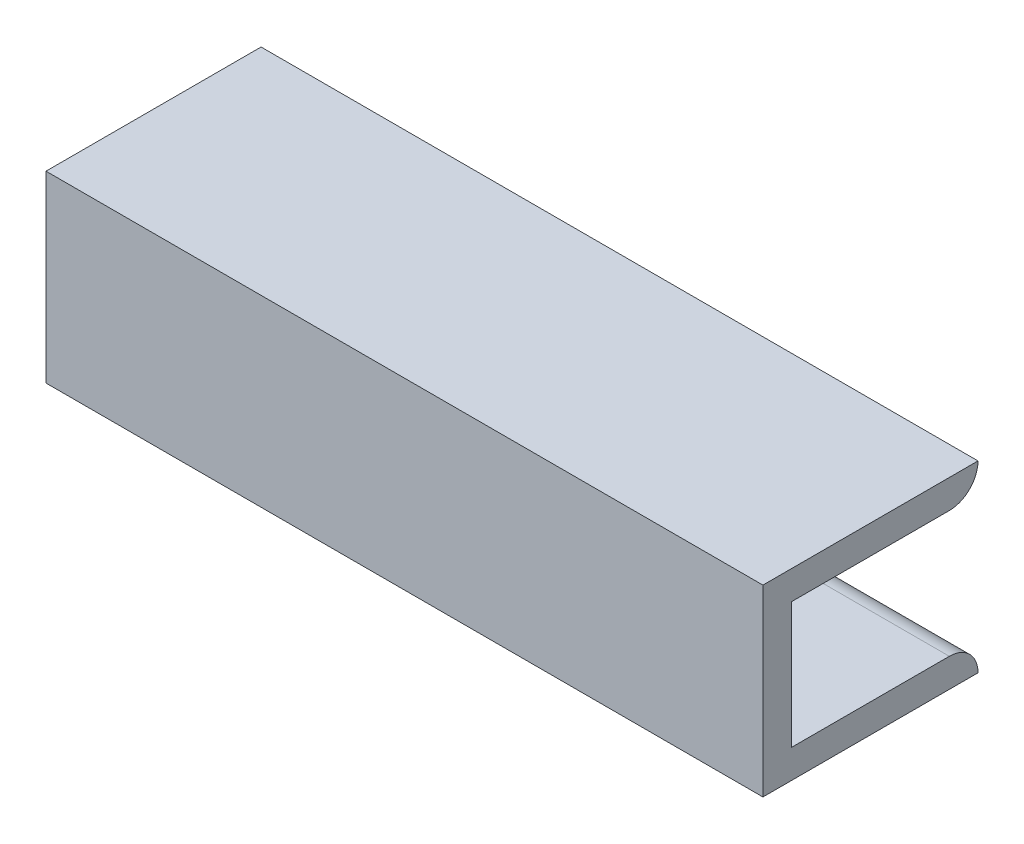
ISO-10303-21;
HEADER;
FILE_DESCRIPTION(('STEP AP214'),'2;1');
FILE_NAME('part.step','',(''),(''),'','','');
FILE_SCHEMA(('AUTOMOTIVE_DESIGN { 1 0 10303 214 1 1 1 1 }'));
ENDSEC;
DATA;
#1=APPLICATION_CONTEXT('core data for automotive mechanical design processes');
#2=APPLICATION_PROTOCOL_DEFINITION('international standard','automotive_design',2000,#1);
#3=PRODUCT_CONTEXT('',#1,'mechanical');
#4=PRODUCT('Part','Part','',(#3));
#5=PRODUCT_RELATED_PRODUCT_CATEGORY('part','',(#4));
#6=PRODUCT_DEFINITION_FORMATION('','',#4);
#7=PRODUCT_DEFINITION_CONTEXT('part definition',#1,'design');
#8=PRODUCT_DEFINITION('design','',#6,#7);
#9=PRODUCT_DEFINITION_SHAPE('','',#8);
#10=(LENGTH_UNIT() NAMED_UNIT(*) SI_UNIT(.MILLI.,.METRE.));
#11=(NAMED_UNIT(*) PLANE_ANGLE_UNIT() SI_UNIT($,.RADIAN.));
#12=(NAMED_UNIT(*) SI_UNIT($,.STERADIAN.) SOLID_ANGLE_UNIT());
#13=UNCERTAINTY_MEASURE_WITH_UNIT(LENGTH_MEASURE(1.E-05),#10,'distance_accuracy_value','');
#14=(GEOMETRIC_REPRESENTATION_CONTEXT(3) GLOBAL_UNCERTAINTY_ASSIGNED_CONTEXT((#13)) GLOBAL_UNIT_ASSIGNED_CONTEXT((#10,
#11,#12)) REPRESENTATION_CONTEXT('',''));
#15=CARTESIAN_POINT('',(0.,0.,0.));
#16=DIRECTION('',(0.,0.,1.));
#17=DIRECTION('',(1.,0.,0.));
#18=AXIS2_PLACEMENT_3D('',#15,#16,#17);
#19=CARTESIAN_POINT('',(0.,0.,13.));
#20=DIRECTION('',(0.,0.,-1.));
#21=DIRECTION('',(-1.,0.,0.));
#22=AXIS2_PLACEMENT_3D('',#19,#20,#21);
#23=PLANE('',#22);
#24=DIRECTION('',(0.,-1.,0.));
#25=VECTOR('',#24,1.);
#26=CARTESIAN_POINT('',(0.,-2.,13.));
#27=LINE('',#26,#25);
#28=CARTESIAN_POINT('',(0.,8.8,13.));
#29=VERTEX_POINT('',#28);
#30=CARTESIAN_POINT('',(0.,0.,13.));
#31=VERTEX_POINT('',#30);
#32=EDGE_CURVE('E185',#29,#31,#27,.T.);
#33=ORIENTED_EDGE('',*,*,#32,.F.);
#34=DIRECTION('',(1.,0.,0.));
#35=VECTOR('',#34,1.);
#36=CARTESIAN_POINT('',(0.,8.8,13.));
#37=LINE('',#36,#35);
#38=CARTESIAN_POINT('',(50.,8.8,13.));
#39=VERTEX_POINT('',#38);
#40=EDGE_CURVE('E138',#29,#39,#37,.T.);
#41=ORIENTED_EDGE('',*,*,#40,.T.);
#42=DIRECTION('',(0.,1.,0.));
#43=VECTOR('',#42,1.);
#44=CARTESIAN_POINT('',(50.,-2.,13.));
#45=LINE('',#44,#43);
#46=CARTESIAN_POINT('',(50.,0.,13.));
#47=VERTEX_POINT('',#46);
#48=EDGE_CURVE('E184',#47,#39,#45,.T.);
#49=ORIENTED_EDGE('',*,*,#48,.F.);
#50=DIRECTION('',(1.,0.,0.));
#51=VECTOR('',#50,1.);
#52=CARTESIAN_POINT('',(0.,0.,13.));
#53=LINE('',#52,#51);
#54=EDGE_CURVE('E163',#31,#47,#53,.T.);
#55=ORIENTED_EDGE('',*,*,#54,.F.);
#56=EDGE_LOOP('',(#33,#41,#49,#55));
#57=FACE_BOUND('',#56,.T.);
#58=ADVANCED_FACE('F44',(#57),#23,.T.);
#59=CARTESIAN_POINT('',(0.,0.,15.));
#60=DIRECTION('',(1.,0.,0.));
#61=DIRECTION('',(0.,1.,0.));
#62=AXIS2_PLACEMENT_3D('',#59,#60,#61);
#63=PLANE('',#62);
#64=DIRECTION('',(0.,0.,-1.));
#65=VECTOR('',#64,1.);
#66=CARTESIAN_POINT('',(0.,0.,15.));
#67=LINE('',#66,#65);
#68=CARTESIAN_POINT('',(0.,0.,2.));
#69=VERTEX_POINT('',#68);
#70=EDGE_CURVE('E165',#31,#69,#67,.T.);
#71=ORIENTED_EDGE('',*,*,#70,.T.);
#72=CARTESIAN_POINT('',(0.,-2.,2.));
#73=DIRECTION('',(1.,0.,0.));
#74=DIRECTION('',(0.,1.,0.));
#75=AXIS2_PLACEMENT_3D('',#72,#73,#74);
#76=CIRCLE('',#75,2.);
#77=CARTESIAN_POINT('',(0.,-2.,0.));
#78=VERTEX_POINT('',#77);
#79=EDGE_CURVE('E131',#69,#78,#76,.F.);
#80=ORIENTED_EDGE('',*,*,#79,.T.);
#81=DIRECTION('',(0.,0.,-1.));
#82=VECTOR('',#81,1.);
#83=CARTESIAN_POINT('',(0.,-2.,15.));
#84=LINE('',#83,#82);
#85=CARTESIAN_POINT('',(0.,-2.,15.));
#86=VERTEX_POINT('',#85);
#87=EDGE_CURVE('E169',#86,#78,#84,.T.);
#88=ORIENTED_EDGE('',*,*,#87,.F.);
#89=DIRECTION('',(0.,-1.,0.));
#90=VECTOR('',#89,1.);
#91=CARTESIAN_POINT('',(0.,0.,15.));
#92=LINE('',#91,#90);
#93=CARTESIAN_POINT('',(0.,10.8,15.));
#94=VERTEX_POINT('',#93);
#95=EDGE_CURVE('E114',#94,#86,#92,.T.);
#96=ORIENTED_EDGE('',*,*,#95,.F.);
#97=DIRECTION('',(0.,0.,1.));
#98=VECTOR('',#97,1.);
#99=CARTESIAN_POINT('',(0.,10.8,13.));
#100=LINE('',#99,#98);
#101=CARTESIAN_POINT('',(0.,10.8,0.));
#102=VERTEX_POINT('',#101);
#103=EDGE_CURVE('E109',#102,#94,#100,.T.);
#104=ORIENTED_EDGE('',*,*,#103,.F.);
#105=CARTESIAN_POINT('',(0.,10.8,2.));
#106=DIRECTION('',(1.,0.,0.));
#107=DIRECTION('',(0.,1.,0.));
#108=AXIS2_PLACEMENT_3D('',#105,#106,#107);
#109=CIRCLE('',#108,2.);
#110=CARTESIAN_POINT('',(0.,8.8,2.));
#111=VERTEX_POINT('',#110);
#112=EDGE_CURVE('E67',#102,#111,#109,.F.);
#113=ORIENTED_EDGE('',*,*,#112,.T.);
#114=DIRECTION('',(0.,0.,-1.));
#115=VECTOR('',#114,1.);
#116=CARTESIAN_POINT('',(0.,8.8,15.));
#117=LINE('',#116,#115);
#118=EDGE_CURVE('E229',#29,#111,#117,.T.);
#119=ORIENTED_EDGE('',*,*,#118,.F.);
#120=ORIENTED_EDGE('',*,*,#32,.T.);
#121=EDGE_LOOP('',(#71,#80,#88,#96,#104,#113,#119,#120));
#122=FACE_BOUND('',#121,.T.);
#123=ADVANCED_FACE('F112',(#122),#63,.F.);
#124=CARTESIAN_POINT('',(0.,-2.,15.));
#125=DIRECTION('',(0.,1.,0.));
#126=DIRECTION('',(0.,0.,1.));
#127=AXIS2_PLACEMENT_3D('',#124,#125,#126);
#128=PLANE('',#127);
#129=DIRECTION('',(1.,0.,0.));
#130=VECTOR('',#129,1.);
#131=CARTESIAN_POINT('',(0.,-2.,0.));
#132=LINE('',#131,#130);
#133=CARTESIAN_POINT('',(50.,-2.,0.));
#134=VERTEX_POINT('',#133);
#135=EDGE_CURVE('E119',#78,#134,#132,.T.);
#136=ORIENTED_EDGE('',*,*,#135,.T.);
#137=DIRECTION('',(0.,0.,-1.));
#138=VECTOR('',#137,1.);
#139=CARTESIAN_POINT('',(50.,-2.,15.));
#140=LINE('',#139,#138);
#141=CARTESIAN_POINT('',(50.,-2.,15.));
#142=VERTEX_POINT('',#141);
#143=EDGE_CURVE('E153',#142,#134,#140,.T.);
#144=ORIENTED_EDGE('',*,*,#143,.F.);
#145=DIRECTION('',(1.,0.,0.));
#146=VECTOR('',#145,1.);
#147=CARTESIAN_POINT('',(0.,-2.,15.));
#148=LINE('',#147,#146);
#149=EDGE_CURVE('E173',#86,#142,#148,.T.);
#150=ORIENTED_EDGE('',*,*,#149,.F.);
#151=ORIENTED_EDGE('',*,*,#87,.T.);
#152=EDGE_LOOP('',(#136,#144,#150,#151));
#153=FACE_BOUND('',#152,.T.);
#154=ADVANCED_FACE('F172',(#153),#128,.F.);
#155=CARTESIAN_POINT('',(50.,0.,15.));
#156=DIRECTION('',(-1.,0.,0.));
#157=DIRECTION('',(0.,0.,1.));
#158=AXIS2_PLACEMENT_3D('',#155,#156,#157);
#159=PLANE('',#158);
#160=ORIENTED_EDGE('',*,*,#143,.T.);
#161=CARTESIAN_POINT('',(50.,-2.,2.));
#162=DIRECTION('',(-1.,0.,0.));
#163=DIRECTION('',(0.,0.,1.));
#164=AXIS2_PLACEMENT_3D('',#161,#162,#163);
#165=CIRCLE('',#164,2.);
#166=CARTESIAN_POINT('',(50.,0.,2.));
#167=VERTEX_POINT('',#166);
#168=EDGE_CURVE('E53',#134,#167,#165,.F.);
#169=ORIENTED_EDGE('',*,*,#168,.T.);
#170=DIRECTION('',(0.,0.,-1.));
#171=VECTOR('',#170,1.);
#172=CARTESIAN_POINT('',(50.,0.,15.));
#173=LINE('',#172,#171);
#174=EDGE_CURVE('E150',#47,#167,#173,.T.);
#175=ORIENTED_EDGE('',*,*,#174,.F.);
#176=ORIENTED_EDGE('',*,*,#48,.T.);
#177=DIRECTION('',(0.,0.,-1.));
#178=VECTOR('',#177,1.);
#179=CARTESIAN_POINT('',(50.,8.8,15.));
#180=LINE('',#179,#178);
#181=CARTESIAN_POINT('',(50.,8.8,2.));
#182=VERTEX_POINT('',#181);
#183=EDGE_CURVE('E128',#39,#182,#180,.T.);
#184=ORIENTED_EDGE('',*,*,#183,.T.);
#185=CARTESIAN_POINT('',(50.,10.8,2.));
#186=DIRECTION('',(-1.,0.,0.));
#187=DIRECTION('',(0.,0.,1.));
#188=AXIS2_PLACEMENT_3D('',#185,#186,#187);
#189=CIRCLE('',#188,2.);
#190=CARTESIAN_POINT('',(50.,10.8,0.));
#191=VERTEX_POINT('',#190);
#192=EDGE_CURVE('E60',#182,#191,#189,.F.);
#193=ORIENTED_EDGE('',*,*,#192,.T.);
#194=DIRECTION('',(0.,0.,1.));
#195=VECTOR('',#194,1.);
#196=CARTESIAN_POINT('',(50.,10.8,13.));
#197=LINE('',#196,#195);
#198=CARTESIAN_POINT('',(50.,10.8,15.));
#199=VERTEX_POINT('',#198);
#200=EDGE_CURVE('E120',#191,#199,#197,.T.);
#201=ORIENTED_EDGE('',*,*,#200,.T.);
#202=DIRECTION('',(0.,1.,0.));
#203=VECTOR('',#202,1.);
#204=CARTESIAN_POINT('',(50.,0.,15.));
#205=LINE('',#204,#203);
#206=EDGE_CURVE('E201',#142,#199,#205,.T.);
#207=ORIENTED_EDGE('',*,*,#206,.F.);
#208=EDGE_LOOP('',(#160,#169,#175,#176,#184,#193,#201,#207));
#209=FACE_BOUND('',#208,.T.);
#210=ADVANCED_FACE('F148',(#209),#159,.F.);
#211=CARTESIAN_POINT('',(0.,0.,15.));
#212=DIRECTION('',(0.,-1.,0.));
#213=DIRECTION('',(0.,0.,-1.));
#214=AXIS2_PLACEMENT_3D('',#211,#212,#213);
#215=PLANE('',#214);
#216=ORIENTED_EDGE('',*,*,#174,.T.);
#217=DIRECTION('',(-1.,0.,0.));
#218=VECTOR('',#217,1.);
#219=CARTESIAN_POINT('',(0.,0.,2.));
#220=LINE('',#219,#218);
#221=EDGE_CURVE('E132',#167,#69,#220,.T.);
#222=ORIENTED_EDGE('',*,*,#221,.T.);
#223=ORIENTED_EDGE('',*,*,#70,.F.);
#224=ORIENTED_EDGE('',*,*,#54,.T.);
#225=EDGE_LOOP('',(#216,#222,#223,#224));
#226=FACE_BOUND('',#225,.T.);
#227=ADVANCED_FACE('F160',(#226),#215,.F.);
#228=CARTESIAN_POINT('',(0.,0.,15.));
#229=DIRECTION('',(0.,0.,1.));
#230=DIRECTION('',(1.,0.,0.));
#231=AXIS2_PLACEMENT_3D('',#228,#229,#230);
#232=PLANE('',#231);
#233=ORIENTED_EDGE('',*,*,#95,.T.);
#234=ORIENTED_EDGE('',*,*,#149,.T.);
#235=ORIENTED_EDGE('',*,*,#206,.T.);
#236=DIRECTION('',(-1.,0.,0.));
#237=VECTOR('',#236,1.);
#238=CARTESIAN_POINT('',(0.,10.8,15.));
#239=LINE('',#238,#237);
#240=EDGE_CURVE('E127',#199,#94,#239,.T.);
#241=ORIENTED_EDGE('',*,*,#240,.T.);
#242=EDGE_LOOP('',(#233,#234,#235,#241));
#243=FACE_BOUND('',#242,.T.);
#244=ADVANCED_FACE('F208',(#243),#232,.T.);
#245=CARTESIAN_POINT('',(0.,10.8,13.));
#246=DIRECTION('',(0.,1.,0.));
#247=DIRECTION('',(0.,0.,1.));
#248=AXIS2_PLACEMENT_3D('',#245,#246,#247);
#249=PLANE('',#248);
#250=ORIENTED_EDGE('',*,*,#240,.F.);
#251=ORIENTED_EDGE('',*,*,#200,.F.);
#252=DIRECTION('',(-1.,0.,0.));
#253=VECTOR('',#252,1.);
#254=CARTESIAN_POINT('',(0.,10.8,0.));
#255=LINE('',#254,#253);
#256=EDGE_CURVE('E123',#191,#102,#255,.T.);
#257=ORIENTED_EDGE('',*,*,#256,.T.);
#258=ORIENTED_EDGE('',*,*,#103,.T.);
#259=EDGE_LOOP('',(#250,#251,#257,#258));
#260=FACE_BOUND('',#259,.T.);
#261=ADVANCED_FACE('F124',(#260),#249,.T.);
#262=CARTESIAN_POINT('',(0.,8.8,15.));
#263=DIRECTION('',(0.,1.,0.));
#264=DIRECTION('',(0.,0.,1.));
#265=AXIS2_PLACEMENT_3D('',#262,#263,#264);
#266=PLANE('',#265);
#267=ORIENTED_EDGE('',*,*,#118,.T.);
#268=DIRECTION('',(1.,0.,0.));
#269=VECTOR('',#268,1.);
#270=CARTESIAN_POINT('',(50.,8.8,2.));
#271=LINE('',#270,#269);
#272=EDGE_CURVE('E11',#111,#182,#271,.T.);
#273=ORIENTED_EDGE('',*,*,#272,.T.);
#274=ORIENTED_EDGE('',*,*,#183,.F.);
#275=ORIENTED_EDGE('',*,*,#40,.F.);
#276=EDGE_LOOP('',(#267,#273,#274,#275));
#277=FACE_BOUND('',#276,.T.);
#278=ADVANCED_FACE('F216',(#277),#266,.F.);
#279=CARTESIAN_POINT('',(0.,-2.,2.));
#280=DIRECTION('',(-1.,0.,0.));
#281=DIRECTION('',(0.,0.,1.));
#282=AXIS2_PLACEMENT_3D('',#279,#280,#281);
#283=CYLINDRICAL_SURFACE('',#282,2.);
#284=ORIENTED_EDGE('',*,*,#168,.F.);
#285=ORIENTED_EDGE('',*,*,#135,.F.);
#286=ORIENTED_EDGE('',*,*,#79,.F.);
#287=ORIENTED_EDGE('',*,*,#221,.F.);
#288=EDGE_LOOP('',(#284,#285,#286,#287));
#289=FACE_BOUND('',#288,.T.);
#290=ADVANCED_FACE('F167',(#289),#283,.T.);
#291=CARTESIAN_POINT('',(0.,10.8,2.));
#292=DIRECTION('',(-1.,0.,0.));
#293=DIRECTION('',(0.,0.,1.));
#294=AXIS2_PLACEMENT_3D('',#291,#292,#293);
#295=CYLINDRICAL_SURFACE('',#294,2.);
#296=ORIENTED_EDGE('',*,*,#112,.F.);
#297=ORIENTED_EDGE('',*,*,#256,.F.);
#298=ORIENTED_EDGE('',*,*,#192,.F.);
#299=ORIENTED_EDGE('',*,*,#272,.F.);
#300=EDGE_LOOP('',(#296,#297,#298,#299));
#301=FACE_BOUND('',#300,.T.);
#302=ADVANCED_FACE('F46',(#301),#295,.T.);
#303=CLOSED_SHELL('',(#58,#123,#154,#210,#227,#244,#261,#278,#290,#302));
#304=MANIFOLD_SOLID_BREP('B2',#303);
#305=ADVANCED_BREP_SHAPE_REPRESENTATION('',(#18,#304),#14);
#306=SHAPE_DEFINITION_REPRESENTATION(#9,#305);
ENDSEC;
END-ISO-10303-21;
